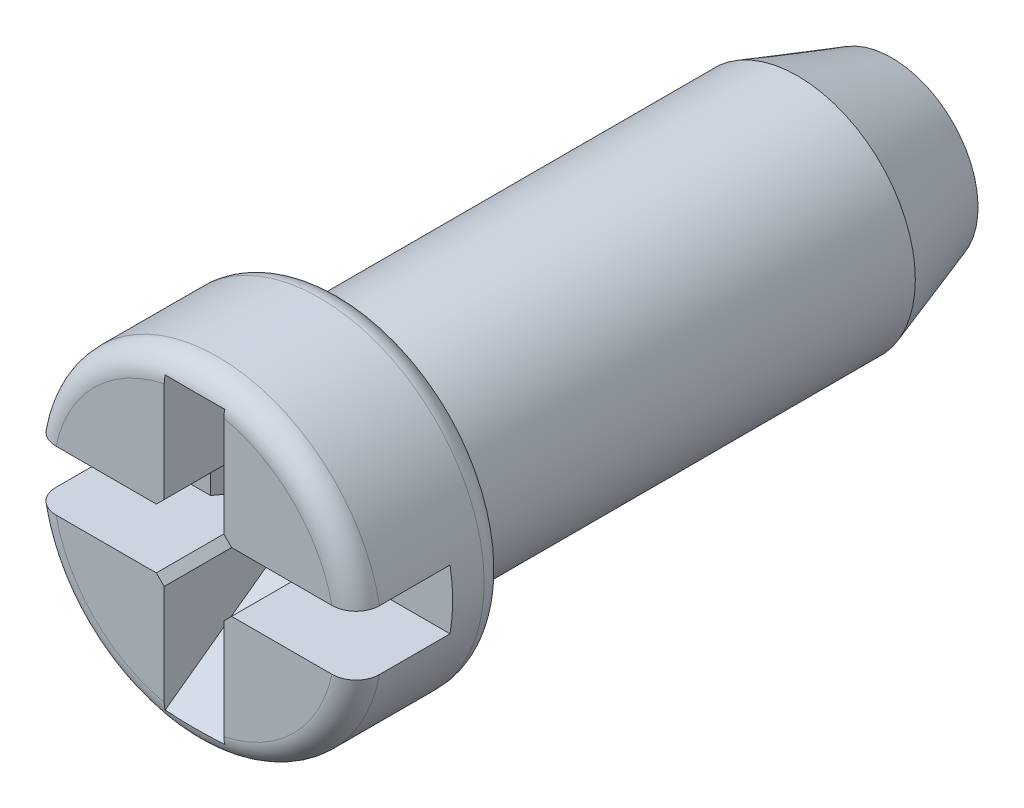
ISO-10303-21;
HEADER;
FILE_DESCRIPTION(('STEP AP214'),'2;1');
FILE_NAME('part.step','',(''),(''),'','','');
FILE_SCHEMA(('AUTOMOTIVE_DESIGN { 1 0 10303 214 1 1 1 1 }'));
ENDSEC;
DATA;
#1=APPLICATION_CONTEXT('core data for automotive mechanical design processes');
#2=APPLICATION_PROTOCOL_DEFINITION('international standard','automotive_design',2000,#1);
#3=PRODUCT_CONTEXT('',#1,'mechanical');
#4=PRODUCT('Part','Part','',(#3));
#5=PRODUCT_RELATED_PRODUCT_CATEGORY('part','',(#4));
#6=PRODUCT_DEFINITION_FORMATION('','',#4);
#7=PRODUCT_DEFINITION_CONTEXT('part definition',#1,'design');
#8=PRODUCT_DEFINITION('design','',#6,#7);
#9=PRODUCT_DEFINITION_SHAPE('','',#8);
#10=(LENGTH_UNIT() NAMED_UNIT(*) SI_UNIT(.MILLI.,.METRE.));
#11=(NAMED_UNIT(*) PLANE_ANGLE_UNIT() SI_UNIT($,.RADIAN.));
#12=(NAMED_UNIT(*) SI_UNIT($,.STERADIAN.) SOLID_ANGLE_UNIT());
#13=UNCERTAINTY_MEASURE_WITH_UNIT(LENGTH_MEASURE(1.E-05),#10,'distance_accuracy_value','');
#14=(GEOMETRIC_REPRESENTATION_CONTEXT(3) GLOBAL_UNCERTAINTY_ASSIGNED_CONTEXT((#13)) GLOBAL_UNIT_ASSIGNED_CONTEXT((#10,
#11,#12)) REPRESENTATION_CONTEXT('',''));
#15=CARTESIAN_POINT('',(0.,0.,0.));
#16=DIRECTION('',(0.,0.,1.));
#17=DIRECTION('',(1.,0.,0.));
#18=AXIS2_PLACEMENT_3D('',#15,#16,#17);
#19=CARTESIAN_POINT('',(2.54,-0.25,4.35));
#20=DIRECTION('',(0.,0.,1.));
#21=DIRECTION('',(0.,-1.,0.));
#22=AXIS2_PLACEMENT_3D('',#19,#20,#21);
#23=PLANE('',#22);
#24=DIRECTION('',(0.,1.,0.));
#25=VECTOR('',#24,1.);
#26=CARTESIAN_POINT('',(2.78,-0.25,4.35));
#27=LINE('',#26,#25);
#28=CARTESIAN_POINT('',(2.78,-0.0599999999999999,4.35));
#29=VERTEX_POINT('',#28);
#30=CARTESIAN_POINT('',(2.78,-0.44,4.35));
#31=VERTEX_POINT('',#30);
#32=EDGE_CURVE('E586',#29,#31,#27,.F.);
#33=ORIENTED_EDGE('',*,*,#32,.F.);
#34=DIRECTION('',(-0.707106781186548,0.707106781186548,0.));
#35=VECTOR('',#34,1.);
#36=CARTESIAN_POINT('',(2.73,-0.01,4.35));
#37=LINE('',#36,#35);
#38=CARTESIAN_POINT('',(2.73,-0.00999999999999998,4.35));
#39=VERTEX_POINT('',#38);
#40=EDGE_CURVE('E591',#29,#39,#37,.T.);
#41=ORIENTED_EDGE('',*,*,#40,.T.);
#42=DIRECTION('',(1.,0.,0.));
#43=VECTOR('',#42,1.);
#44=CARTESIAN_POINT('',(2.54,-0.01,4.35));
#45=LINE('',#44,#43);
#46=CARTESIAN_POINT('',(2.35,-0.01,4.35));
#47=VERTEX_POINT('',#46);
#48=EDGE_CURVE('E438',#47,#39,#45,.T.);
#49=ORIENTED_EDGE('',*,*,#48,.F.);
#50=DIRECTION('',(-0.707106781186548,-0.707106781186548,0.));
#51=VECTOR('',#50,1.);
#52=CARTESIAN_POINT('',(2.3,-0.06,4.35));
#53=LINE('',#52,#51);
#54=CARTESIAN_POINT('',(2.3,-0.06,4.35));
#55=VERTEX_POINT('',#54);
#56=EDGE_CURVE('E472',#47,#55,#53,.T.);
#57=ORIENTED_EDGE('',*,*,#56,.T.);
#58=DIRECTION('',(0.,1.,0.));
#59=VECTOR('',#58,1.);
#60=CARTESIAN_POINT('',(2.3,-0.25,4.35));
#61=LINE('',#60,#59);
#62=CARTESIAN_POINT('',(2.3,-0.44,4.35));
#63=VERTEX_POINT('',#62);
#64=EDGE_CURVE('E475',#63,#55,#61,.T.);
#65=ORIENTED_EDGE('',*,*,#64,.F.);
#66=DIRECTION('',(0.707106781186548,-0.707106781186548,0.));
#67=VECTOR('',#66,1.);
#68=CARTESIAN_POINT('',(2.35,-0.49,4.35));
#69=LINE('',#68,#67);
#70=CARTESIAN_POINT('',(2.35,-0.49,4.35));
#71=VERTEX_POINT('',#70);
#72=EDGE_CURVE('E480',#63,#71,#69,.T.);
#73=ORIENTED_EDGE('',*,*,#72,.T.);
#74=DIRECTION('',(1.,0.,0.));
#75=VECTOR('',#74,1.);
#76=CARTESIAN_POINT('',(2.54,-0.49,4.35));
#77=LINE('',#76,#75);
#78=CARTESIAN_POINT('',(2.73,-0.49,4.35));
#79=VERTEX_POINT('',#78);
#80=EDGE_CURVE('E515',#79,#71,#77,.F.);
#81=ORIENTED_EDGE('',*,*,#80,.F.);
#82=DIRECTION('',(0.707106781186548,0.707106781186548,0.));
#83=VECTOR('',#82,1.);
#84=CARTESIAN_POINT('',(2.78,-0.44,4.35));
#85=LINE('',#84,#83);
#86=EDGE_CURVE('E578',#79,#31,#85,.T.);
#87=ORIENTED_EDGE('',*,*,#86,.T.);
#88=EDGE_LOOP('',(#33,#41,#49,#57,#65,#73,#81,#87));
#89=FACE_BOUND('',#88,.T.);
#90=ADVANCED_FACE('F17',(#89),#23,.T.);
#91=CARTESIAN_POINT('',(2.73,-0.01,4.35));
#92=DIRECTION('',(0.707106781186548,0.707106781186548,0.));
#93=DIRECTION('',(-0.707106781186548,0.707106781186548,0.));
#94=AXIS2_PLACEMENT_3D('',#91,#92,#93);
#95=PLANE('',#94);
#96=DIRECTION('',(0.,0.,-1.));
#97=VECTOR('',#96,1.);
#98=CARTESIAN_POINT('',(2.78,-0.06,4.35));
#99=LINE('',#98,#97);
#100=CARTESIAN_POINT('',(2.78,-0.0600000000000002,5.3));
#101=VERTEX_POINT('',#100);
#102=EDGE_CURVE('E437',#101,#29,#99,.T.);
#103=ORIENTED_EDGE('',*,*,#102,.F.);
#104=DIRECTION('',(-0.707106781186545,0.70710678118655,0.));
#105=VECTOR('',#104,1.);
#106=CARTESIAN_POINT('',(2.78,-0.06,5.3));
#107=LINE('',#106,#105);
#108=CARTESIAN_POINT('',(2.73,-0.01,5.3));
#109=VERTEX_POINT('',#108);
#110=EDGE_CURVE('E460',#101,#109,#107,.T.);
#111=ORIENTED_EDGE('',*,*,#110,.T.);
#112=DIRECTION('',(0.,0.,1.));
#113=VECTOR('',#112,1.);
#114=CARTESIAN_POINT('',(2.73,-0.01,4.35));
#115=LINE('',#114,#113);
#116=EDGE_CURVE('E474',#39,#109,#115,.T.);
#117=ORIENTED_EDGE('',*,*,#116,.F.);
#118=ORIENTED_EDGE('',*,*,#40,.F.);
#119=EDGE_LOOP('',(#103,#111,#117,#118));
#120=FACE_BOUND('',#119,.T.);
#121=ADVANCED_FACE('F692',(#120),#95,.F.);
#122=CARTESIAN_POINT('',(2.78,-0.25,4.35));
#123=DIRECTION('',(-0.809016994375191,0.,0.587785252292138));
#124=DIRECTION('',(0.587785252292138,0.,0.809016994375191));
#125=AXIS2_PLACEMENT_3D('',#122,#123,#124);
#126=PLANE('',#125);
#127=DIRECTION('',(0.58778525229266,0.,0.809016994374812));
#128=VECTOR('',#127,1.);
#129=CARTESIAN_POINT('',(2.78,-0.06,4.35));
#130=LINE('',#129,#128);
#131=CARTESIAN_POINT('',(3.034289884802,-0.06,4.7));
#132=VERTEX_POINT('',#131);
#133=EDGE_CURVE('E427',#29,#132,#130,.T.);
#134=ORIENTED_EDGE('',*,*,#133,.F.);
#135=ORIENTED_EDGE('',*,*,#32,.T.);
#136=DIRECTION('',(-0.58778525229266,0.,-0.809016994374812));
#137=VECTOR('',#136,1.);
#138=CARTESIAN_POINT('',(3.034289884802,-0.44,4.7));
#139=LINE('',#138,#137);
#140=CARTESIAN_POINT('',(3.034289884802,-0.44,4.7));
#141=VERTEX_POINT('',#140);
#142=EDGE_CURVE('E570',#141,#31,#139,.T.);
#143=ORIENTED_EDGE('',*,*,#142,.F.);
#144=DIRECTION('',(0.,-1.,0.));
#145=VECTOR('',#144,1.);
#146=CARTESIAN_POINT('',(3.034289884802,-0.25,4.7));
#147=LINE('',#146,#145);
#148=EDGE_CURVE('E426',#132,#141,#147,.T.);
#149=ORIENTED_EDGE('',*,*,#148,.F.);
#150=EDGE_LOOP('',(#134,#135,#143,#149));
#151=FACE_BOUND('',#150,.T.);
#152=ADVANCED_FACE('F688',(#151),#126,.T.);
#153=CARTESIAN_POINT('',(2.78,-0.44,4.35));
#154=DIRECTION('',(0.707106781186548,-0.707106781186548,0.));
#155=DIRECTION('',(0.707106781186548,0.707106781186548,0.));
#156=AXIS2_PLACEMENT_3D('',#153,#154,#155);
#157=PLANE('',#156);
#158=DIRECTION('',(0.,0.,1.));
#159=VECTOR('',#158,1.);
#160=CARTESIAN_POINT('',(2.73,-0.49,4.35));
#161=LINE('',#160,#159);
#162=CARTESIAN_POINT('',(2.73,-0.49,5.3));
#163=VERTEX_POINT('',#162);
#164=EDGE_CURVE('E526',#163,#79,#161,.F.);
#165=ORIENTED_EDGE('',*,*,#164,.F.);
#166=DIRECTION('',(0.707106781186545,0.707106781186549,0.));
#167=VECTOR('',#166,1.);
#168=CARTESIAN_POINT('',(2.73,-0.49,5.3));
#169=LINE('',#168,#167);
#170=CARTESIAN_POINT('',(2.78,-0.44,5.3));
#171=VERTEX_POINT('',#170);
#172=EDGE_CURVE('E532',#163,#171,#169,.T.);
#173=ORIENTED_EDGE('',*,*,#172,.T.);
#174=DIRECTION('',(0.,0.,1.));
#175=VECTOR('',#174,1.);
#176=CARTESIAN_POINT('',(2.78,-0.44,4.35));
#177=LINE('',#176,#175);
#178=EDGE_CURVE('E417',#31,#171,#177,.T.);
#179=ORIENTED_EDGE('',*,*,#178,.F.);
#180=ORIENTED_EDGE('',*,*,#86,.F.);
#181=EDGE_LOOP('',(#165,#173,#179,#180));
#182=FACE_BOUND('',#181,.T.);
#183=ADVANCED_FACE('F683',(#182),#157,.F.);
#184=CARTESIAN_POINT('',(2.35,-0.49,4.35));
#185=DIRECTION('',(1.,0.,0.));
#186=DIRECTION('',(0.,1.,0.));
#187=AXIS2_PLACEMENT_3D('',#184,#185,#186);
#188=PLANE('',#187);
#189=DIRECTION('',(0.,1.,0.));
#190=VECTOR('',#189,1.);
#191=CARTESIAN_POINT('',(2.35,-0.25,5.3));
#192=LINE('',#191,#190);
#193=CARTESIAN_POINT('',(2.35,-0.49,5.3));
#194=VERTEX_POINT('',#193);
#195=CARTESIAN_POINT('',(2.35,-1.129715863219,5.3));
#196=VERTEX_POINT('',#195);
#197=EDGE_CURVE('E508',#194,#196,#192,.F.);
#198=ORIENTED_EDGE('',*,*,#197,.T.);
#199=CARTESIAN_POINT('',(2.35,-1.17528794399066,5.29321793642558));
#200=CARTESIAN_POINT('',(2.35,-1.16786019100313,5.29547442705925));
#201=CARTESIAN_POINT('',(2.35,-1.16034864111171,5.29716784434062));
#202=CARTESIAN_POINT('',(2.35,-1.14515794752109,5.29942853219876));
#203=CARTESIAN_POINT('',(2.35,-1.1374788038219,5.29999580277553));
#204=CARTESIAN_POINT('',(2.35,-1.12971586321882,5.3));
#205=B_SPLINE_CURVE_WITH_KNOTS('',3,(#199,#200,#201,#202,#203,#204),.UNSPECIFIED.,.F.,.F.,(4,2,
4),(0.,0.0231002033484853,0.0462004066969706),.UNSPECIFIED.);
#206=CARTESIAN_POINT('',(2.35,-1.17528794399062,5.29321793642594));
#207=VERTEX_POINT('',#206);
#208=EDGE_CURVE('E281',#207,#196,#205,.T.);
#209=ORIENTED_EDGE('',*,*,#208,.F.);
#210=DIRECTION('',(0.,-0.587785252292138,0.809016994375191));
#211=VECTOR('',#210,1.);
#212=CARTESIAN_POINT('',(2.35,-0.49,4.35));
#213=LINE('',#212,#211);
#214=EDGE_CURVE('E521',#71,#207,#213,.T.);
#215=ORIENTED_EDGE('',*,*,#214,.F.);
#216=DIRECTION('',(0.,0.,1.));
#217=VECTOR('',#216,1.);
#218=CARTESIAN_POINT('',(2.35,-0.49,4.35));
#219=LINE('',#218,#217);
#220=EDGE_CURVE('E497',#71,#194,#219,.T.);
#221=ORIENTED_EDGE('',*,*,#220,.T.);
#222=EDGE_LOOP('',(#198,#209,#215,#221));
#223=FACE_BOUND('',#222,.T.);
#224=ADVANCED_FACE('F885',(#223),#188,.T.);
#225=CARTESIAN_POINT('',(2.54,-0.25,5.3));
#226=DIRECTION('',(0.,0.,-1.));
#227=DIRECTION('',(0.,1.,0.));
#228=AXIS2_PLACEMENT_3D('',#225,#226,#227);
#229=PLANE('',#228);
#230=ORIENTED_EDGE('',*,*,#172,.F.);
#231=DIRECTION('',(0.,-1.,0.));
#232=VECTOR('',#231,1.);
#233=CARTESIAN_POINT('',(2.73,-0.44,5.3));
#234=LINE('',#233,#232);
#235=CARTESIAN_POINT('',(2.73,-1.129715863219,5.3));
#236=VERTEX_POINT('',#235);
#237=EDGE_CURVE('E529',#236,#163,#234,.F.);
#238=ORIENTED_EDGE('',*,*,#237,.F.);
#239=CARTESIAN_POINT('',(2.54,-0.25,5.3));
#240=DIRECTION('',(0.,0.,-1.));
#241=DIRECTION('',(0.977462070243846,-0.211111111111222,0.));
#242=AXIS2_PLACEMENT_3D('',#239,#240,#241);
#243=CIRCLE('',#242,0.899999999999528);
#244=CARTESIAN_POINT('',(3.419715863219,-0.44,5.3));
#245=VERTEX_POINT('',#244);
#246=EDGE_CURVE('E274',#245,#236,#243,.T.);
#247=ORIENTED_EDGE('',*,*,#246,.F.);
#248=DIRECTION('',(-1.,0.,0.));
#249=VECTOR('',#248,1.);
#250=CARTESIAN_POINT('',(2.78,-0.44,5.3));
#251=LINE('',#250,#249);
#252=EDGE_CURVE('E415',#171,#245,#251,.F.);
#253=ORIENTED_EDGE('',*,*,#252,.F.);
#254=EDGE_LOOP('',(#230,#238,#247,#253));
#255=FACE_BOUND('',#254,.T.);
#256=ADVANCED_FACE('F264',(#255),#229,.F.);
#257=CARTESIAN_POINT('',(2.73,-0.44,4.35));
#258=DIRECTION('',(-1.,0.,0.));
#259=DIRECTION('',(0.,-1.,0.));
#260=AXIS2_PLACEMENT_3D('',#257,#258,#259);
#261=PLANE('',#260);
#262=DIRECTION('',(0.,-0.587785252292138,0.809016994375191));
#263=VECTOR('',#262,1.);
#264=CARTESIAN_POINT('',(2.73,-0.49,4.35));
#265=LINE('',#264,#263);
#266=CARTESIAN_POINT('',(2.72999999999998,-1.17528794399037,5.29321793642602));
#267=VERTEX_POINT('',#266);
#268=EDGE_CURVE('E518',#267,#79,#265,.F.);
#269=ORIENTED_EDGE('',*,*,#268,.F.);
#270=CARTESIAN_POINT('',(2.73,-1.129715863219,5.3));
#271=CARTESIAN_POINT('',(2.73000000000006,-1.13747880382197,5.29999580277552));
#272=CARTESIAN_POINT('',(2.73000000000006,-1.14515794752105,5.29942853219876));
#273=CARTESIAN_POINT('',(2.72999999999994,-1.16034864111145,5.29716784434067));
#274=CARTESIAN_POINT('',(2.72999999999983,-1.16786019100277,5.29547442705935));
#275=CARTESIAN_POINT('',(2.72999999999966,-1.1752879439902,5.29321793642574));
#276=B_SPLINE_CURVE_WITH_KNOTS('',3,(#270,#271,#272,#273,#274,#275),.UNSPECIFIED.,.F.,.F.,(4,2,
4),(0.,0.0231002033481508,0.0462004066963016),.UNSPECIFIED.);
#277=EDGE_CURVE('E249',#236,#267,#276,.T.);
#278=ORIENTED_EDGE('',*,*,#277,.F.);
#279=ORIENTED_EDGE('',*,*,#237,.T.);
#280=ORIENTED_EDGE('',*,*,#164,.T.);
#281=EDGE_LOOP('',(#269,#278,#279,#280));
#282=FACE_BOUND('',#281,.T.);
#283=ADVANCED_FACE('F257',(#282),#261,.T.);
#284=CARTESIAN_POINT('',(2.54,-0.49,4.35));
#285=DIRECTION('',(0.,0.809016994375191,0.587785252292138));
#286=DIRECTION('',(0.,-0.587785252292138,0.809016994375191));
#287=AXIS2_PLACEMENT_3D('',#284,#285,#286);
#288=PLANE('',#287);
#289=ORIENTED_EDGE('',*,*,#268,.T.);
#290=ORIENTED_EDGE('',*,*,#80,.T.);
#291=ORIENTED_EDGE('',*,*,#214,.T.);
#292=CARTESIAN_POINT('',(2.72999999999996,-1.17528794399016,5.29321793642574));
#293=CARTESIAN_POINT('',(2.70498775813376,-1.17620444173661,5.2944793873541));
#294=CARTESIAN_POINT('',(2.67995488409184,-1.1768552673268,5.29537517192982));
#295=CARTESIAN_POINT('',(2.62986620669892,-1.17776537255638,5.29662782431354));
#296=CARTESIAN_POINT('',(2.60481040224218,-1.17802463219728,5.29698466459599));
#297=CARTESIAN_POINT('',(2.55472996489115,-1.17829116210163,5.29735151153761));
#298=CARTESIAN_POINT('',(2.52970533469258,-1.17829876586319,5.29736197721754));
#299=CARTESIAN_POINT('',(2.47965914607785,-1.17806200670166,5.2970361061881));
#300=CARTESIAN_POINT('',(2.45463758758179,-1.17781765320802,5.29669978245725));
#301=CARTESIAN_POINT('',(2.416347824759,-1.17716277324673,5.29579841751845));
#302=CARTESIAN_POINT('',(2.40307331156991,-1.17688400595116,5.29541472725281));
#303=CARTESIAN_POINT('',(2.37652996463301,-1.17619330962101,5.29446406531146));
#304=CARTESIAN_POINT('',(2.3632611343217,-1.17578133560674,5.29389703172652));
#305=CARTESIAN_POINT('',(2.35000000000004,-1.17528794399016,5.29321793642574));
#306=B_SPLINE_CURVE_WITH_KNOTS('',3,(#292,#293,#294,#295,#296,#297,#298,#299,#300,#301,#302,
#303,#304,#305),.UNSPECIFIED.,.F.,.F.,(4,2,2,2,2,2,4),(0.,0.0751676009782569,0.150339040866805,
0.225410858451387,0.300479866590125,0.340327118084086,0.380187838807192),.UNSPECIFIED.);
#307=EDGE_CURVE('E240',#267,#207,#306,.T.);
#308=ORIENTED_EDGE('',*,*,#307,.F.);
#309=EDGE_LOOP('',(#289,#290,#291,#308));
#310=FACE_BOUND('',#309,.T.);
#311=ADVANCED_FACE('F251',(#310),#288,.T.);
#312=CARTESIAN_POINT('',(2.54,-0.25,5.3));
#313=DIRECTION('',(0.,0.,-1.));
#314=DIRECTION('',(0.,1.,0.));
#315=AXIS2_PLACEMENT_3D('',#312,#313,#314);
#316=PLANE('',#315);
#317=DIRECTION('',(0.707106781186548,-0.707106781186548,0.));
#318=VECTOR('',#317,1.);
#319=CARTESIAN_POINT('',(2.35,-0.49,5.3));
#320=LINE('',#319,#318);
#321=CARTESIAN_POINT('',(2.3,-0.44,5.3));
#322=VERTEX_POINT('',#321);
#323=EDGE_CURVE('E493',#194,#322,#320,.F.);
#324=ORIENTED_EDGE('',*,*,#323,.T.);
#325=DIRECTION('',(-1.,0.,0.));
#326=VECTOR('',#325,1.);
#327=CARTESIAN_POINT('',(2.35,-0.44,5.3));
#328=LINE('',#327,#326);
#329=CARTESIAN_POINT('',(1.660284136781,-0.44,5.3));
#330=VERTEX_POINT('',#329);
#331=EDGE_CURVE('E248',#330,#322,#328,.F.);
#332=ORIENTED_EDGE('',*,*,#331,.F.);
#333=CARTESIAN_POINT('',(2.54,-0.25,5.3));
#334=DIRECTION('',(0.,0.,-1.));
#335=DIRECTION('',(-0.211111111111221,-0.977462070243846,0.));
#336=AXIS2_PLACEMENT_3D('',#333,#334,#335);
#337=CIRCLE('',#336,0.899999999999528);
#338=EDGE_CURVE('E275',#196,#330,#337,.T.);
#339=ORIENTED_EDGE('',*,*,#338,.F.);
#340=ORIENTED_EDGE('',*,*,#197,.F.);
#341=EDGE_LOOP('',(#324,#332,#339,#340));
#342=FACE_BOUND('',#341,.T.);
#343=ADVANCED_FACE('F256',(#342),#316,.F.);
#344=CARTESIAN_POINT('',(2.35,-0.49,4.35));
#345=DIRECTION('',(-0.707106781186548,-0.707106781186548,0.));
#346=DIRECTION('',(0.707106781186548,-0.707106781186548,0.));
#347=AXIS2_PLACEMENT_3D('',#344,#345,#346);
#348=PLANE('',#347);
#349=DIRECTION('',(0.,0.,1.));
#350=VECTOR('',#349,1.);
#351=CARTESIAN_POINT('',(2.3,-0.44,4.35));
#352=LINE('',#351,#350);
#353=EDGE_CURVE('E405',#322,#63,#352,.F.);
#354=ORIENTED_EDGE('',*,*,#353,.F.);
#355=ORIENTED_EDGE('',*,*,#323,.F.);
#356=ORIENTED_EDGE('',*,*,#220,.F.);
#357=ORIENTED_EDGE('',*,*,#72,.F.);
#358=EDGE_LOOP('',(#354,#355,#356,#357));
#359=FACE_BOUND('',#358,.T.);
#360=ADVANCED_FACE('F325',(#359),#348,.F.);
#361=CARTESIAN_POINT('',(2.3,-0.25,4.35));
#362=DIRECTION('',(0.809016994375191,0.,0.587785252292138));
#363=DIRECTION('',(0.587785252292138,0.,-0.809016994375191));
#364=AXIS2_PLACEMENT_3D('',#361,#362,#363);
#365=PLANE('',#364);
#366=DIRECTION('',(-0.58778525229266,0.,0.809016994374812));
#367=VECTOR('',#366,1.);
#368=CARTESIAN_POINT('',(2.3,-0.44,4.35));
#369=LINE('',#368,#367);
#370=CARTESIAN_POINT('',(2.045710115198,-0.44,4.7));
#371=VERTEX_POINT('',#370);
#372=EDGE_CURVE('E483',#63,#371,#369,.T.);
#373=ORIENTED_EDGE('',*,*,#372,.F.);
#374=ORIENTED_EDGE('',*,*,#64,.T.);
#375=DIRECTION('',(0.58778525229266,0.,-0.809016994374812));
#376=VECTOR('',#375,1.);
#377=CARTESIAN_POINT('',(2.045710115198,-0.0599999999999997,4.7));
#378=LINE('',#377,#376);
#379=CARTESIAN_POINT('',(2.045710115198,-0.0599999999999997,4.7));
#380=VERTEX_POINT('',#379);
#381=EDGE_CURVE('E469',#380,#55,#378,.T.);
#382=ORIENTED_EDGE('',*,*,#381,.F.);
#383=DIRECTION('',(0.,-1.,0.));
#384=VECTOR('',#383,1.);
#385=CARTESIAN_POINT('',(2.045710115198,-0.25,4.7));
#386=LINE('',#385,#384);
#387=EDGE_CURVE('E396',#371,#380,#386,.F.);
#388=ORIENTED_EDGE('',*,*,#387,.F.);
#389=EDGE_LOOP('',(#373,#374,#382,#388));
#390=FACE_BOUND('',#389,.T.);
#391=ADVANCED_FACE('F322',(#390),#365,.T.);
#392=CARTESIAN_POINT('',(2.3,-0.06,4.35));
#393=DIRECTION('',(-0.707106781186548,0.707106781186548,0.));
#394=DIRECTION('',(-0.707106781186548,-0.707106781186548,0.));
#395=AXIS2_PLACEMENT_3D('',#392,#393,#394);
#396=PLANE('',#395);
#397=DIRECTION('',(0.,0.,1.));
#398=VECTOR('',#397,1.);
#399=CARTESIAN_POINT('',(2.35,-0.01,4.35));
#400=LINE('',#399,#398);
#401=CARTESIAN_POINT('',(2.35,-0.01,5.3));
#402=VERTEX_POINT('',#401);
#403=EDGE_CURVE('E449',#402,#47,#400,.F.);
#404=ORIENTED_EDGE('',*,*,#403,.F.);
#405=DIRECTION('',(-0.707106781186548,-0.707106781186547,0.));
#406=VECTOR('',#405,1.);
#407=CARTESIAN_POINT('',(2.35,-0.01,5.3));
#408=LINE('',#407,#406);
#409=CARTESIAN_POINT('',(2.3,-0.0600000000000002,5.3));
#410=VERTEX_POINT('',#409);
#411=EDGE_CURVE('E452',#402,#410,#408,.T.);
#412=ORIENTED_EDGE('',*,*,#411,.T.);
#413=DIRECTION('',(0.,0.,1.));
#414=VECTOR('',#413,1.);
#415=CARTESIAN_POINT('',(2.3,-0.06,4.35));
#416=LINE('',#415,#414);
#417=EDGE_CURVE('E170',#55,#410,#416,.T.);
#418=ORIENTED_EDGE('',*,*,#417,.F.);
#419=ORIENTED_EDGE('',*,*,#56,.F.);
#420=EDGE_LOOP('',(#404,#412,#418,#419));
#421=FACE_BOUND('',#420,.T.);
#422=ADVANCED_FACE('F316',(#421),#396,.F.);
#423=CARTESIAN_POINT('',(2.73,-0.01,4.35));
#424=DIRECTION('',(-1.,0.,0.));
#425=DIRECTION('',(0.,-1.,0.));
#426=AXIS2_PLACEMENT_3D('',#423,#424,#425);
#427=PLANE('',#426);
#428=DIRECTION('',(0.,1.,0.));
#429=VECTOR('',#428,1.);
#430=CARTESIAN_POINT('',(2.73,-0.25,5.3));
#431=LINE('',#430,#429);
#432=CARTESIAN_POINT('',(2.73,0.629715863219,5.3));
#433=VERTEX_POINT('',#432);
#434=EDGE_CURVE('E457',#109,#433,#431,.T.);
#435=ORIENTED_EDGE('',*,*,#434,.T.);
#436=CARTESIAN_POINT('',(2.73,0.675287943990664,5.29321793642558));
#437=CARTESIAN_POINT('',(2.73,0.66786019100313,5.29547442705925));
#438=CARTESIAN_POINT('',(2.73,0.660348641111709,5.29716784434062));
#439=CARTESIAN_POINT('',(2.73,0.645157947521093,5.29942853219876));
#440=CARTESIAN_POINT('',(2.73,0.637478803821898,5.29999580277553));
#441=CARTESIAN_POINT('',(2.73,0.629715863218816,5.3));
#442=B_SPLINE_CURVE_WITH_KNOTS('',3,(#436,#437,#438,#439,#440,#441),.UNSPECIFIED.,.F.,.F.,(4,2,
4),(0.,0.0231002033484852,0.0462004066969706),.UNSPECIFIED.);
#443=CARTESIAN_POINT('',(2.73,0.675287943990619,5.29321793642595));
#444=VERTEX_POINT('',#443);
#445=EDGE_CURVE('E302',#444,#433,#442,.T.);
#446=ORIENTED_EDGE('',*,*,#445,.F.);
#447=DIRECTION('',(0.,-0.587785252292138,-0.809016994375191));
#448=VECTOR('',#447,1.);
#449=CARTESIAN_POINT('',(2.73,-0.00999999999999994,4.35));
#450=LINE('',#449,#448);
#451=EDGE_CURVE('E444',#39,#444,#450,.F.);
#452=ORIENTED_EDGE('',*,*,#451,.F.);
#453=ORIENTED_EDGE('',*,*,#116,.T.);
#454=EDGE_LOOP('',(#435,#446,#452,#453));
#455=FACE_BOUND('',#454,.T.);
#456=ADVANCED_FACE('F310',(#455),#427,.T.);
#457=CARTESIAN_POINT('',(2.54,-0.25,5.3));
#458=DIRECTION('',(0.,0.,-1.));
#459=DIRECTION('',(0.,1.,0.));
#460=AXIS2_PLACEMENT_3D('',#457,#458,#459);
#461=PLANE('',#460);
#462=ORIENTED_EDGE('',*,*,#110,.F.);
#463=DIRECTION('',(1.,0.,0.));
#464=VECTOR('',#463,1.);
#465=CARTESIAN_POINT('',(2.73,-0.0600000000000003,5.3));
#466=LINE('',#465,#464);
#467=CARTESIAN_POINT('',(3.419715863219,-0.0599999999999999,5.3));
#468=VERTEX_POINT('',#467);
#469=EDGE_CURVE('E434',#468,#101,#466,.F.);
#470=ORIENTED_EDGE('',*,*,#469,.F.);
#471=CARTESIAN_POINT('',(2.54,-0.25,5.3));
#472=DIRECTION('',(0.,0.,-1.));
#473=DIRECTION('',(0.211111111111222,0.977462070243846,0.));
#474=AXIS2_PLACEMENT_3D('',#471,#472,#473);
#475=CIRCLE('',#474,0.899999999999528);
#476=EDGE_CURVE('E193',#433,#468,#475,.T.);
#477=ORIENTED_EDGE('',*,*,#476,.F.);
#478=ORIENTED_EDGE('',*,*,#434,.F.);
#479=EDGE_LOOP('',(#462,#470,#477,#478));
#480=FACE_BOUND('',#479,.T.);
#481=ADVANCED_FACE('F315',(#480),#461,.F.);
#482=CARTESIAN_POINT('',(2.54,-0.25,5.3));
#483=DIRECTION('',(0.,0.,-1.));
#484=DIRECTION('',(0.,1.,0.));
#485=AXIS2_PLACEMENT_3D('',#482,#483,#484);
#486=PLANE('',#485);
#487=ORIENTED_EDGE('',*,*,#411,.F.);
#488=DIRECTION('',(0.,1.,0.));
#489=VECTOR('',#488,1.);
#490=CARTESIAN_POINT('',(2.35,-0.06,5.3));
#491=LINE('',#490,#489);
#492=CARTESIAN_POINT('',(2.35,0.629715863219,5.3));
#493=VERTEX_POINT('',#492);
#494=EDGE_CURVE('E179',#493,#402,#491,.F.);
#495=ORIENTED_EDGE('',*,*,#494,.F.);
#496=CARTESIAN_POINT('',(2.54,-0.25,5.3));
#497=DIRECTION('',(0.,0.,-1.));
#498=DIRECTION('',(-0.977462070243846,0.211111111111222,0.));
#499=AXIS2_PLACEMENT_3D('',#496,#497,#498);
#500=CIRCLE('',#499,0.899999999999528);
#501=CARTESIAN_POINT('',(1.660284136781,-0.0599999999999999,5.3));
#502=VERTEX_POINT('',#501);
#503=EDGE_CURVE('E175',#502,#493,#500,.T.);
#504=ORIENTED_EDGE('',*,*,#503,.F.);
#505=DIRECTION('',(1.,0.,0.));
#506=VECTOR('',#505,1.);
#507=CARTESIAN_POINT('',(2.3,-0.0600000000000003,5.3));
#508=LINE('',#507,#506);
#509=EDGE_CURVE('E165',#410,#502,#508,.F.);
#510=ORIENTED_EDGE('',*,*,#509,.F.);
#511=EDGE_LOOP('',(#487,#495,#504,#510));
#512=FACE_BOUND('',#511,.T.);
#513=ADVANCED_FACE('F177',(#512),#486,.F.);
#514=CARTESIAN_POINT('',(2.35,-0.06,4.35));
#515=DIRECTION('',(1.,0.,0.));
#516=DIRECTION('',(0.,1.,0.));
#517=AXIS2_PLACEMENT_3D('',#514,#515,#516);
#518=PLANE('',#517);
#519=DIRECTION('',(0.,-0.587785252292138,-0.809016994375191));
#520=VECTOR('',#519,1.);
#521=CARTESIAN_POINT('',(2.35,-0.0100000000000001,4.35));
#522=LINE('',#521,#520);
#523=CARTESIAN_POINT('',(2.35000000000002,0.675287943990366,5.29321793642602));
#524=VERTEX_POINT('',#523);
#525=EDGE_CURVE('E441',#524,#47,#522,.T.);
#526=ORIENTED_EDGE('',*,*,#525,.F.);
#527=CARTESIAN_POINT('',(2.35,0.629715863219,5.3));
#528=CARTESIAN_POINT('',(2.34999999999994,0.637478803821967,5.29999580277552));
#529=CARTESIAN_POINT('',(2.34999999999994,0.64515794752105,5.29942853219876));
#530=CARTESIAN_POINT('',(2.35000000000006,0.660348641111451,5.29716784434067));
#531=CARTESIAN_POINT('',(2.35000000000017,0.667860191002768,5.29547442705935));
#532=CARTESIAN_POINT('',(2.35000000000034,0.675287943990203,5.29321793642574));
#533=B_SPLINE_CURVE_WITH_KNOTS('',3,(#527,#528,#529,#530,#531,#532),.UNSPECIFIED.,.F.,.F.,(4,2,
4),(0.,0.0231002033481507,0.0462004066963017),.UNSPECIFIED.);
#534=EDGE_CURVE('E184',#493,#524,#533,.T.);
#535=ORIENTED_EDGE('',*,*,#534,.F.);
#536=ORIENTED_EDGE('',*,*,#494,.T.);
#537=ORIENTED_EDGE('',*,*,#403,.T.);
#538=EDGE_LOOP('',(#526,#535,#536,#537));
#539=FACE_BOUND('',#538,.T.);
#540=ADVANCED_FACE('F643',(#539),#518,.T.);
#541=CARTESIAN_POINT('',(2.54,-0.01,4.35));
#542=DIRECTION('',(0.,-0.809016994375191,0.587785252292138));
#543=DIRECTION('',(0.,-0.587785252292138,-0.809016994375191));
#544=AXIS2_PLACEMENT_3D('',#541,#542,#543);
#545=PLANE('',#544);
#546=ORIENTED_EDGE('',*,*,#525,.T.);
#547=ORIENTED_EDGE('',*,*,#48,.T.);
#548=ORIENTED_EDGE('',*,*,#451,.T.);
#549=CARTESIAN_POINT('',(2.35000000000004,0.675287943990159,5.29321793642574));
#550=CARTESIAN_POINT('',(2.37501224186624,0.676204441736606,5.2944793873541));
#551=CARTESIAN_POINT('',(2.40004511590816,0.676855267326801,5.29537517192982));
#552=CARTESIAN_POINT('',(2.45013379330108,0.677765372556376,5.29662782431354));
#553=CARTESIAN_POINT('',(2.47518959775782,0.678024632197282,5.29698466459599));
#554=CARTESIAN_POINT('',(2.52527003510885,0.678291162101633,5.29735151153761));
#555=CARTESIAN_POINT('',(2.55029466530742,0.678298765863191,5.29736197721754));
#556=CARTESIAN_POINT('',(2.60034085392215,0.678062006701658,5.2970361061881));
#557=CARTESIAN_POINT('',(2.62536241241821,0.677817653208018,5.29669978245725));
#558=CARTESIAN_POINT('',(2.663652175241,0.677162773246731,5.29579841751846));
#559=CARTESIAN_POINT('',(2.67692668843009,0.676884005951161,5.29541472725281));
#560=CARTESIAN_POINT('',(2.70347003536699,0.676193309621009,5.29446406531146));
#561=CARTESIAN_POINT('',(2.7167388656783,0.675781335606744,5.29389703172652));
#562=CARTESIAN_POINT('',(2.72999999999996,0.675287943990159,5.29321793642574));
#563=B_SPLINE_CURVE_WITH_KNOTS('',3,(#549,#550,#551,#552,#553,#554,#555,#556,#557,#558,#559,
#560,#561,#562),.UNSPECIFIED.,.F.,.F.,(4,2,2,2,2,2,4),(0.,0.0751676009782568,0.150339040866804,
0.225410858451387,0.300479866590125,0.340327118084087,0.380187838807193),.UNSPECIFIED.);
#564=EDGE_CURVE('E433',#524,#444,#563,.T.);
#565=ORIENTED_EDGE('',*,*,#564,.F.);
#566=EDGE_LOOP('',(#546,#547,#548,#565));
#567=FACE_BOUND('',#566,.T.);
#568=ADVANCED_FACE('F293',(#567),#545,.T.);
#569=CARTESIAN_POINT('',(2.73,-0.06,4.35));
#570=DIRECTION('',(0.,-1.,0.));
#571=DIRECTION('',(0.,0.,-1.));
#572=AXIS2_PLACEMENT_3D('',#569,#570,#571);
#573=PLANE('',#572);
#574=DIRECTION('',(0.,0.,-1.));
#575=VECTOR('',#574,1.);
#576=CARTESIAN_POINT('',(3.57266645147405,-0.0599999999999916,5.3));
#577=LINE('',#576,#575);
#578=CARTESIAN_POINT('',(3.57266645147405,-0.0599999999999959,5.15));
#579=VERTEX_POINT('',#578);
#580=CARTESIAN_POINT('',(3.57266645147405,-0.0599999999999957,4.7));
#581=VERTEX_POINT('',#580);
#582=EDGE_CURVE('E430',#579,#581,#577,.T.);
#583=ORIENTED_EDGE('',*,*,#582,.F.);
#584=CARTESIAN_POINT('',(3.419715863219,-0.0600000000000003,5.3));
#585=CARTESIAN_POINT('',(3.42845704761649,-0.0599999999987743,5.30000571424307));
#586=CARTESIAN_POINT('',(3.4371971628062,-0.0599999999992618,5.29926986777367));
#587=CARTESIAN_POINT('',(3.45443270035419,-0.0600000000007384,5.29635394398987));
#588=CARTESIAN_POINT('',(3.46292813086455,-0.0600000000017276,5.29417391484905));
#589=CARTESIAN_POINT('',(3.47943928784338,-0.0600000000012823,5.28840609143572));
#590=CARTESIAN_POINT('',(3.4874546056069,-0.0599999999998457,5.28481711686325));
#591=CARTESIAN_POINT('',(3.50274865947515,-0.0600000000001544,5.27634246872457));
#592=CARTESIAN_POINT('',(3.51002770326696,-0.0600000000018982,5.27145733993613));
#593=CARTESIAN_POINT('',(3.53025701030179,-0.0600000000054099,5.25513846486962));
#594=CARTESIAN_POINT('',(3.54188225464779,-0.0600000000055695,5.24194110992826));
#595=CARTESIAN_POINT('',(3.55531203879512,-0.0600000000019872,5.22000802755361));
#596=CARTESIAN_POINT('',(3.55910667708027,-0.0600000000001837,5.212405977566));
#597=CARTESIAN_POINT('',(3.5653484286725,-0.0599999999998166,5.19666445654866));
#598=CARTESIAN_POINT('',(3.56779667349248,-0.0600000000012502,5.18852544324764));
#599=CARTESIAN_POINT('',(3.5716191617594,-0.0600000000033558,5.17030397651579));
#600=CARTESIAN_POINT('',(3.57268451879283,-0.0600000000038207,5.16015596243736));
#601=CARTESIAN_POINT('',(3.57266645147405,-0.0600000000000033,5.15));
#602=B_SPLINE_CURVE_WITH_KNOTS('',3,(#584,#585,#586,#587,#588,#589,#590,#591,#592,#593,#594,
#595,#596,#597,#598,#599,#600,#601),.UNSPECIFIED.,.F.,.F.,(4,2,2,2,2,2,2,2,4),(0.,
0.0261907757403494,0.0523806778794856,0.0785925667684232,0.104793456120656,0.156338502301432,
0.181730830679375,0.207101786533811,0.237499334161733),.UNSPECIFIED.);
#603=EDGE_CURVE('E191',#468,#579,#602,.T.);
#604=ORIENTED_EDGE('',*,*,#603,.F.);
#605=ORIENTED_EDGE('',*,*,#469,.T.);
#606=ORIENTED_EDGE('',*,*,#102,.T.);
#607=ORIENTED_EDGE('',*,*,#133,.T.);
#608=DIRECTION('',(1.,0.,0.));
#609=VECTOR('',#608,1.);
#610=CARTESIAN_POINT('',(2.54,-0.06,4.7));
#611=LINE('',#610,#609);
#612=EDGE_CURVE('E423',#581,#132,#611,.F.);
#613=ORIENTED_EDGE('',*,*,#612,.F.);
#614=EDGE_LOOP('',(#583,#604,#605,#606,#607,#613));
#615=FACE_BOUND('',#614,.T.);
#616=ADVANCED_FACE('F289',(#615),#573,.T.);
#617=CARTESIAN_POINT('',(2.54,-0.25,4.7));
#618=DIRECTION('',(0.,0.,1.));
#619=DIRECTION('',(0.,-1.,0.));
#620=AXIS2_PLACEMENT_3D('',#617,#618,#619);
#621=PLANE('',#620);
#622=DIRECTION('',(-1.,0.,0.));
#623=VECTOR('',#622,1.);
#624=CARTESIAN_POINT('',(2.78,-0.44,4.7));
#625=LINE('',#624,#623);
#626=CARTESIAN_POINT('',(3.57266645147405,-0.440000000000004,4.7));
#627=VERTEX_POINT('',#626);
#628=EDGE_CURVE('E80',#627,#141,#625,.T.);
#629=ORIENTED_EDGE('',*,*,#628,.F.);
#630=CARTESIAN_POINT('',(2.54,-0.25,4.7));
#631=DIRECTION('',(0.,0.,-1.));
#632=DIRECTION('',(0.,1.,0.));
#633=AXIS2_PLACEMENT_3D('',#630,#631,#632);
#634=CIRCLE('',#633,1.05);
#635=EDGE_CURVE('E414',#581,#627,#634,.T.);
#636=ORIENTED_EDGE('',*,*,#635,.F.);
#637=ORIENTED_EDGE('',*,*,#612,.T.);
#638=ORIENTED_EDGE('',*,*,#148,.T.);
#639=EDGE_LOOP('',(#629,#636,#637,#638));
#640=FACE_BOUND('',#639,.T.);
#641=ADVANCED_FACE('F286',(#640),#621,.T.);
#642=CARTESIAN_POINT('',(2.78,-0.44,4.35));
#643=DIRECTION('',(0.,1.,0.));
#644=DIRECTION('',(-1.,0.,0.));
#645=AXIS2_PLACEMENT_3D('',#642,#643,#644);
#646=PLANE('',#645);
#647=DIRECTION('',(0.,0.,-1.));
#648=VECTOR('',#647,1.);
#649=CARTESIAN_POINT('',(3.57266645147405,-0.440000000000009,5.3));
#650=LINE('',#649,#648);
#651=CARTESIAN_POINT('',(3.57266645147405,-0.440000000000005,5.15));
#652=VERTEX_POINT('',#651);
#653=EDGE_CURVE('E409',#627,#652,#650,.F.);
#654=ORIENTED_EDGE('',*,*,#653,.F.);
#655=ORIENTED_EDGE('',*,*,#628,.T.);
#656=ORIENTED_EDGE('',*,*,#142,.T.);
#657=ORIENTED_EDGE('',*,*,#178,.T.);
#658=ORIENTED_EDGE('',*,*,#252,.T.);
#659=CARTESIAN_POINT('',(3.57266645147405,-0.440000000000001,5.15));
#660=CARTESIAN_POINT('',(3.57267354219978,-0.44,5.15833385648544));
#661=CARTESIAN_POINT('',(3.57196051915556,-0.44,5.16666432128973));
#662=CARTESIAN_POINT('',(3.56914991830658,-0.440000000000001,5.18307831530283));
#663=CARTESIAN_POINT('',(3.56705401933524,-0.440000000000001,5.19116213151246));
#664=CARTESIAN_POINT('',(3.56153215574883,-0.440000000000001,5.20686665446864));
#665=CARTESIAN_POINT('',(3.55810573968458,-0.440000000000001,5.21448720301072));
#666=CARTESIAN_POINT('',(3.55003803728829,-0.440000000000001,5.22904535306191));
#667=CARTESIAN_POINT('',(3.54539682250041,-0.440000000000001,5.23598299475692));
#668=CARTESIAN_POINT('',(3.52977444956096,-0.440000000000001,5.25556326239464));
#669=CARTESIAN_POINT('',(3.51711336043566,-0.440000000000001,5.2669212742714));
#670=CARTESIAN_POINT('',(3.48856572622513,-0.440000000000001,5.28505407927947));
#671=CARTESIAN_POINT('',(3.47263093325975,-0.440000000000002,5.29175284047673));
#672=CARTESIAN_POINT('',(3.45015617364944,-0.44,5.29714005319948));
#673=CARTESIAN_POINT('',(3.44411489193978,-0.44,5.29821207422386));
#674=CARTESIAN_POINT('',(3.43195735514345,-0.440000000000001,5.2996404721185));
#675=CARTESIAN_POINT('',(3.42584122671788,-0.440000000000004,5.29999792469477));
#676=CARTESIAN_POINT('',(3.41971586321899,-0.440000000000009,5.3));
#677=B_SPLINE_CURVE_WITH_KNOTS('',3,(#659,#660,#661,#662,#663,#664,#665,#666,#667,#668,#669,
#670,#671,#672,#673,#674,#675,#676),.UNSPECIFIED.,.F.,.F.,(4,2,2,2,2,2,2,2,4),(0.,
0.0249657945812128,0.0499013359201651,0.0748453453800633,0.0997878861219885,0.149830735011045,
0.200672172978797,0.219046947319212,0.237394039517952),.UNSPECIFIED.);
#678=EDGE_CURVE('E73',#652,#245,#677,.T.);
#679=ORIENTED_EDGE('',*,*,#678,.F.);
#680=EDGE_LOOP('',(#654,#655,#656,#657,#658,#679));
#681=FACE_BOUND('',#680,.T.);
#682=ADVANCED_FACE('F282',(#681),#646,.T.);
#683=CARTESIAN_POINT('',(2.54,-0.25,5.15));
#684=DIRECTION('',(0.,0.,-1.));
#685=DIRECTION('',(0.,1.,0.));
#686=AXIS2_PLACEMENT_3D('',#683,#684,#685);
#687=TOROIDAL_SURFACE('',#686,0.9,0.15);
#688=ORIENTED_EDGE('',*,*,#277,.T.);
#689=ORIENTED_EDGE('',*,*,#307,.T.);
#690=ORIENTED_EDGE('',*,*,#208,.T.);
#691=ORIENTED_EDGE('',*,*,#338,.T.);
#692=CARTESIAN_POINT('',(1.50733354852595,-0.44,5.15));
#693=CARTESIAN_POINT('',(1.50732645780022,-0.44,5.15833385648544));
#694=CARTESIAN_POINT('',(1.50803948084444,-0.44,5.16666432128973));
#695=CARTESIAN_POINT('',(1.51085008169342,-0.44,5.18307831530283));
#696=CARTESIAN_POINT('',(1.51294598066476,-0.439999999999999,5.19116213151246));
#697=CARTESIAN_POINT('',(1.51846784425118,-0.439999999999999,5.20686665446864));
#698=CARTESIAN_POINT('',(1.52189426031543,-0.44,5.21448720301072));
#699=CARTESIAN_POINT('',(1.52996196271171,-0.44,5.22904535306191));
#700=CARTESIAN_POINT('',(1.53460317749959,-0.44,5.23598299475692));
#701=CARTESIAN_POINT('',(1.55022555043904,-0.44,5.25556326239464));
#702=CARTESIAN_POINT('',(1.56288663956434,-0.439999999999999,5.2669212742714));
#703=CARTESIAN_POINT('',(1.59143427377487,-0.439999999999999,5.28505407927947));
#704=CARTESIAN_POINT('',(1.60736906674025,-0.440000000000002,5.29175284047673));
#705=CARTESIAN_POINT('',(1.62984382635056,-0.439999999999999,5.29714005319948));
#706=CARTESIAN_POINT('',(1.63588510806022,-0.439999999999998,5.29821207422386));
#707=CARTESIAN_POINT('',(1.64804264485655,-0.440000000000002,5.2996404721185));
#708=CARTESIAN_POINT('',(1.65415877328212,-0.440000000000007,5.29999792469477));
#709=CARTESIAN_POINT('',(1.66028413678101,-0.440000000000018,5.3));
#710=B_SPLINE_CURVE_WITH_KNOTS('',3,(#692,#693,#694,#695,#696,#697,#698,#699,#700,#701,#702,
#703,#704,#705,#706,#707,#708,#709),.UNSPECIFIED.,.F.,.F.,(4,2,2,2,2,2,2,2,4),(0.,
0.0249657945812128,0.0499013359201651,0.0748453453800635,0.0997878861219886,0.149830735011045,
0.200672172978797,0.219046947319211,0.237394039517951),.UNSPECIFIED.);
#711=CARTESIAN_POINT('',(1.50733354852595,-0.440000000000004,5.15));
#712=VERTEX_POINT('',#711);
#713=EDGE_CURVE('E238',#712,#330,#710,.T.);
#714=ORIENTED_EDGE('',*,*,#713,.F.);
#715=CARTESIAN_POINT('',(2.54,-0.25,5.15));
#716=DIRECTION('',(0.,0.,-1.));
#717=DIRECTION('',(0.,1.,0.));
#718=AXIS2_PLACEMENT_3D('',#715,#716,#717);
#719=CIRCLE('',#718,1.05);
#720=EDGE_CURVE('E402',#652,#712,#719,.T.);
#721=ORIENTED_EDGE('',*,*,#720,.F.);
#722=ORIENTED_EDGE('',*,*,#678,.T.);
#723=ORIENTED_EDGE('',*,*,#246,.T.);
#724=EDGE_LOOP('',(#688,#689,#690,#691,#714,#721,#722,#723));
#725=FACE_BOUND('',#724,.T.);
#726=ADVANCED_FACE('F225',(#725),#687,.T.);
#727=CARTESIAN_POINT('',(2.35,-0.44,4.35));
#728=DIRECTION('',(0.,1.,0.));
#729=DIRECTION('',(-1.,0.,0.));
#730=AXIS2_PLACEMENT_3D('',#727,#728,#729);
#731=PLANE('',#730);
#732=DIRECTION('',(0.,0.,-1.));
#733=VECTOR('',#732,1.);
#734=CARTESIAN_POINT('',(1.50733354852595,-0.440000000000009,5.3));
#735=LINE('',#734,#733);
#736=CARTESIAN_POINT('',(1.50733354852595,-0.440000000000004,4.7));
#737=VERTEX_POINT('',#736);
#738=EDGE_CURVE('E399',#712,#737,#735,.T.);
#739=ORIENTED_EDGE('',*,*,#738,.F.);
#740=ORIENTED_EDGE('',*,*,#713,.T.);
#741=ORIENTED_EDGE('',*,*,#331,.T.);
#742=ORIENTED_EDGE('',*,*,#353,.T.);
#743=ORIENTED_EDGE('',*,*,#372,.T.);
#744=DIRECTION('',(1.,0.,0.));
#745=VECTOR('',#744,1.);
#746=CARTESIAN_POINT('',(2.54,-0.44,4.7));
#747=LINE('',#746,#745);
#748=EDGE_CURVE('E393',#737,#371,#747,.T.);
#749=ORIENTED_EDGE('',*,*,#748,.F.);
#750=EDGE_LOOP('',(#739,#740,#741,#742,#743,#749));
#751=FACE_BOUND('',#750,.T.);
#752=ADVANCED_FACE('F221',(#751),#731,.T.);
#753=CARTESIAN_POINT('',(2.54,-0.25,4.7));
#754=DIRECTION('',(0.,0.,1.));
#755=DIRECTION('',(0.,-1.,0.));
#756=AXIS2_PLACEMENT_3D('',#753,#754,#755);
#757=PLANE('',#756);
#758=DIRECTION('',(1.,0.,0.));
#759=VECTOR('',#758,1.);
#760=CARTESIAN_POINT('',(2.3,-0.0600000000000001,4.7));
#761=LINE('',#760,#759);
#762=CARTESIAN_POINT('',(1.50733354852595,-0.0599999999999956,4.7));
#763=VERTEX_POINT('',#762);
#764=EDGE_CURVE('E172',#763,#380,#761,.T.);
#765=ORIENTED_EDGE('',*,*,#764,.F.);
#766=CARTESIAN_POINT('',(2.54,-0.25,4.7));
#767=DIRECTION('',(0.,0.,-1.));
#768=DIRECTION('',(0.,1.,0.));
#769=AXIS2_PLACEMENT_3D('',#766,#767,#768);
#770=CIRCLE('',#769,1.05);
#771=EDGE_CURVE('E385',#737,#763,#770,.T.);
#772=ORIENTED_EDGE('',*,*,#771,.F.);
#773=ORIENTED_EDGE('',*,*,#748,.T.);
#774=ORIENTED_EDGE('',*,*,#387,.T.);
#775=EDGE_LOOP('',(#765,#772,#773,#774));
#776=FACE_BOUND('',#775,.T.);
#777=ADVANCED_FACE('F218',(#776),#757,.T.);
#778=CARTESIAN_POINT('',(2.3,-0.06,4.35));
#779=DIRECTION('',(0.,-1.,0.));
#780=DIRECTION('',(1.,0.,0.));
#781=AXIS2_PLACEMENT_3D('',#778,#779,#780);
#782=PLANE('',#781);
#783=DIRECTION('',(0.,0.,-1.));
#784=VECTOR('',#783,1.);
#785=CARTESIAN_POINT('',(1.50733354852595,-0.0599999999999923,5.3));
#786=LINE('',#785,#784);
#787=CARTESIAN_POINT('',(1.50733354852595,-0.0599999999999954,5.15));
#788=VERTEX_POINT('',#787);
#789=EDGE_CURVE('E382',#763,#788,#786,.F.);
#790=ORIENTED_EDGE('',*,*,#789,.F.);
#791=ORIENTED_EDGE('',*,*,#764,.T.);
#792=ORIENTED_EDGE('',*,*,#381,.T.);
#793=ORIENTED_EDGE('',*,*,#417,.T.);
#794=ORIENTED_EDGE('',*,*,#509,.T.);
#795=CARTESIAN_POINT('',(1.50733354852595,-0.0599999999999986,5.15));
#796=CARTESIAN_POINT('',(1.50732645780022,-0.059999999999999,5.15833385648544));
#797=CARTESIAN_POINT('',(1.50803948084444,-0.0599999999999991,5.16666432128973));
#798=CARTESIAN_POINT('',(1.51085008169342,-0.0599999999999991,5.18307831530283));
#799=CARTESIAN_POINT('',(1.51294598066476,-0.059999999999999,5.19116213151246));
#800=CARTESIAN_POINT('',(1.51846784425118,-0.059999999999999,5.20686665446864));
#801=CARTESIAN_POINT('',(1.52189426031542,-0.059999999999999,5.21448720301072));
#802=CARTESIAN_POINT('',(1.52996196271171,-0.0599999999999993,5.22904535306191));
#803=CARTESIAN_POINT('',(1.53460317749959,-0.0599999999999995,5.23598299475692));
#804=CARTESIAN_POINT('',(1.55022555043904,-0.0599999999999996,5.25556326239464));
#805=CARTESIAN_POINT('',(1.56288663956434,-0.0599999999999991,5.2669212742714));
#806=CARTESIAN_POINT('',(1.59143427377487,-0.0599999999999986,5.28505407927947));
#807=CARTESIAN_POINT('',(1.60736906674025,-0.0599999999999986,5.29175284047673));
#808=CARTESIAN_POINT('',(1.62984382635056,-0.0599999999999999,5.29714005319948));
#809=CARTESIAN_POINT('',(1.63588510806022,-0.0600000000000003,5.29821207422386));
#810=CARTESIAN_POINT('',(1.64804264485655,-0.0599999999999984,5.2996404721185));
#811=CARTESIAN_POINT('',(1.65415877328212,-0.059999999999996,5.29999792469477));
#812=CARTESIAN_POINT('',(1.66028413678101,-0.0599999999999906,5.3));
#813=B_SPLINE_CURVE_WITH_KNOTS('',3,(#795,#796,#797,#798,#799,#800,#801,#802,#803,#804,#805,
#806,#807,#808,#809,#810,#811,#812),.UNSPECIFIED.,.F.,.F.,(4,2,2,2,2,2,2,2,4),(0.,
0.0249657945812128,0.0499013359201651,0.0748453453800633,0.0997878861219885,0.149830735011044,
0.200672172978796,0.219046947319211,0.237394039517951),.UNSPECIFIED.);
#814=EDGE_CURVE('E41',#788,#502,#813,.T.);
#815=ORIENTED_EDGE('',*,*,#814,.F.);
#816=EDGE_LOOP('',(#790,#791,#792,#793,#794,#815));
#817=FACE_BOUND('',#816,.T.);
#818=ADVANCED_FACE('F167',(#817),#782,.T.);
#819=CARTESIAN_POINT('',(2.54,-0.25,5.15));
#820=DIRECTION('',(0.,0.,-1.));
#821=DIRECTION('',(0.,1.,0.));
#822=AXIS2_PLACEMENT_3D('',#819,#820,#821);
#823=TOROIDAL_SURFACE('',#822,0.9,0.15);
#824=ORIENTED_EDGE('',*,*,#534,.T.);
#825=ORIENTED_EDGE('',*,*,#564,.T.);
#826=ORIENTED_EDGE('',*,*,#445,.T.);
#827=ORIENTED_EDGE('',*,*,#476,.T.);
#828=ORIENTED_EDGE('',*,*,#603,.T.);
#829=CARTESIAN_POINT('',(2.54,-0.25,5.15));
#830=DIRECTION('',(0.,0.,-1.));
#831=DIRECTION('',(0.,1.,0.));
#832=AXIS2_PLACEMENT_3D('',#829,#830,#831);
#833=CIRCLE('',#832,1.05);
#834=EDGE_CURVE('E189',#788,#579,#833,.T.);
#835=ORIENTED_EDGE('',*,*,#834,.F.);
#836=ORIENTED_EDGE('',*,*,#814,.T.);
#837=ORIENTED_EDGE('',*,*,#503,.T.);
#838=EDGE_LOOP('',(#824,#825,#826,#827,#828,#835,#836,#837));
#839=FACE_BOUND('',#838,.T.);
#840=ADVANCED_FACE('F187',(#839),#823,.T.);
#841=CARTESIAN_POINT('',(2.54,-0.25,5.3));
#842=DIRECTION('',(0.,0.,-1.));
#843=DIRECTION('',(0.,1.,0.));
#844=AXIS2_PLACEMENT_3D('',#841,#842,#843);
#845=CYLINDRICAL_SURFACE('',#844,1.05);
#846=ORIENTED_EDGE('',*,*,#834,.T.);
#847=ORIENTED_EDGE('',*,*,#582,.T.);
#848=ORIENTED_EDGE('',*,*,#635,.T.);
#849=ORIENTED_EDGE('',*,*,#653,.T.);
#850=ORIENTED_EDGE('',*,*,#720,.T.);
#851=ORIENTED_EDGE('',*,*,#738,.T.);
#852=ORIENTED_EDGE('',*,*,#771,.T.);
#853=ORIENTED_EDGE('',*,*,#789,.T.);
#854=EDGE_LOOP('',(#846,#847,#848,#849,#850,#851,#852,#853));
#855=FACE_BOUND('',#854,.T.);
#856=CARTESIAN_POINT('',(2.54,-0.25,4.5));
#857=DIRECTION('',(0.,0.,-1.));
#858=DIRECTION('',(0.,1.,0.));
#859=AXIS2_PLACEMENT_3D('',#856,#857,#858);
#860=CIRCLE('',#859,1.05);
#861=CARTESIAN_POINT('',(2.54,0.8,4.5));
#862=VERTEX_POINT('',#861);
#863=EDGE_CURVE('E364',#862,#862,#860,.T.);
#864=ORIENTED_EDGE('',*,*,#863,.F.);
#865=EDGE_LOOP('',(#864));
#866=FACE_BOUND('',#865,.T.);
#867=ADVANCED_FACE('F694',(#855,#866),#845,.T.);
#868=CARTESIAN_POINT('',(2.54,-0.25,0.85));
#869=DIRECTION('',(0.,0.,-1.));
#870=DIRECTION('',(0.,1.,0.));
#871=AXIS2_PLACEMENT_3D('',#868,#869,#870);
#872=PLANE('',#871);
#873=CARTESIAN_POINT('',(2.54,-0.25,0.850000000014006));
#874=DIRECTION('',(0.,0.,1.));
#875=DIRECTION('',(0.,-1.,0.));
#876=AXIS2_PLACEMENT_3D('',#873,#874,#875);
#877=CIRCLE('',#876,0.549999999998136);
#878=CARTESIAN_POINT('',(2.54,-0.799999999998136,0.850000000014006));
#879=VERTEX_POINT('',#878);
#880=EDGE_CURVE('E628',#879,#879,#877,.T.);
#881=ORIENTED_EDGE('',*,*,#880,.F.);
#882=EDGE_LOOP('',(#881));
#883=FACE_BOUND('',#882,.T.);
#884=ADVANCED_FACE('F370',(#883),#872,.T.);
#885=CARTESIAN_POINT('',(2.54,-0.25,4.5));
#886=DIRECTION('',(0.,0.,-1.));
#887=DIRECTION('',(0.,1.,0.));
#888=AXIS2_PLACEMENT_3D('',#885,#886,#887);
#889=TOROIDAL_SURFACE('',#888,0.9,0.15);
#890=CARTESIAN_POINT('',(2.54,-0.25,4.35));
#891=DIRECTION('',(0.,0.,1.));
#892=DIRECTION('',(0.,1.,0.));
#893=AXIS2_PLACEMENT_3D('',#890,#891,#892);
#894=CIRCLE('',#893,0.9);
#895=CARTESIAN_POINT('',(2.54,0.65,4.35));
#896=VERTEX_POINT('',#895);
#897=EDGE_CURVE('E631',#896,#896,#894,.F.);
#898=ORIENTED_EDGE('',*,*,#897,.F.);
#899=EDGE_LOOP('',(#898));
#900=FACE_BOUND('',#899,.T.);
#901=ORIENTED_EDGE('',*,*,#863,.T.);
#902=EDGE_LOOP('',(#901));
#903=FACE_BOUND('',#902,.T.);
#904=ADVANCED_FACE('F366',(#900,#903),#889,.T.);
#905=CARTESIAN_POINT('',(2.54,-0.25,1.45000000003392));
#906=DIRECTION('',(0.,0.,1.));
#907=DIRECTION('',(0.,-1.,0.));
#908=AXIS2_PLACEMENT_3D('',#905,#906,#907);
#909=CONICAL_SURFACE('',#908,0.750000000004775,0.321750554396642);
#910=ORIENTED_EDGE('',*,*,#880,.T.);
#911=EDGE_LOOP('',(#910));
#912=FACE_BOUND('',#911,.T.);
#913=CARTESIAN_POINT('',(2.54,-0.249999999999999,1.45));
#914=DIRECTION('',(0.,0.,-1.));
#915=DIRECTION('',(0.,1.,0.));
#916=AXIS2_PLACEMENT_3D('',#913,#914,#915);
#917=CIRCLE('',#916,0.75);
#918=CARTESIAN_POINT('',(2.54,0.500000000000001,1.45));
#919=VERTEX_POINT('',#918);
#920=EDGE_CURVE('E32',#919,#919,#917,.F.);
#921=ORIENTED_EDGE('',*,*,#920,.F.);
#922=EDGE_LOOP('',(#921));
#923=FACE_BOUND('',#922,.T.);
#924=ADVANCED_FACE('F343',(#912,#923),#909,.T.);
#925=CARTESIAN_POINT('',(2.54,-0.25,4.35));
#926=DIRECTION('',(0.,0.,-1.));
#927=DIRECTION('',(0.,1.,0.));
#928=AXIS2_PLACEMENT_3D('',#925,#926,#927);
#929=PLANE('',#928);
#930=CARTESIAN_POINT('',(2.54,-0.25,4.35));
#931=DIRECTION('',(0.,0.,-1.));
#932=DIRECTION('',(0.,1.,0.));
#933=AXIS2_PLACEMENT_3D('',#930,#931,#932);
#934=CIRCLE('',#933,0.75);
#935=CARTESIAN_POINT('',(2.54,0.5,4.35));
#936=VERTEX_POINT('',#935);
#937=EDGE_CURVE('E11',#936,#936,#934,.T.);
#938=ORIENTED_EDGE('',*,*,#937,.F.);
#939=EDGE_LOOP('',(#938));
#940=FACE_BOUND('',#939,.T.);
#941=ORIENTED_EDGE('',*,*,#897,.T.);
#942=EDGE_LOOP('',(#941));
#943=FACE_BOUND('',#942,.T.);
#944=ADVANCED_FACE('F337',(#940,#943),#929,.T.);
#945=CARTESIAN_POINT('',(2.54,-0.25,4.35));
#946=DIRECTION('',(0.,0.,-1.));
#947=DIRECTION('',(0.,1.,0.));
#948=AXIS2_PLACEMENT_3D('',#945,#946,#947);
#949=CYLINDRICAL_SURFACE('',#948,0.75);
#950=ORIENTED_EDGE('',*,*,#937,.T.);
#951=EDGE_LOOP('',(#950));
#952=FACE_BOUND('',#951,.T.);
#953=ORIENTED_EDGE('',*,*,#920,.T.);
#954=EDGE_LOOP('',(#953));
#955=FACE_BOUND('',#954,.T.);
#956=ADVANCED_FACE('F335',(#952,#955),#949,.T.);
#957=CLOSED_SHELL('',(#90,#121,#152,#183,#224,#256,#283,#311,#343,#360,#391,#422,#456,#481,#513,
#540,#568,#616,#641,#682,#726,#752,#777,#818,#840,#867,#884,#904,#924,#944,#956));
#958=MANIFOLD_SOLID_BREP('B1',#957);
#959=ADVANCED_BREP_SHAPE_REPRESENTATION('',(#18,#958),#14);
#960=SHAPE_DEFINITION_REPRESENTATION(#9,#959);
ENDSEC;
END-ISO-10303-21;
